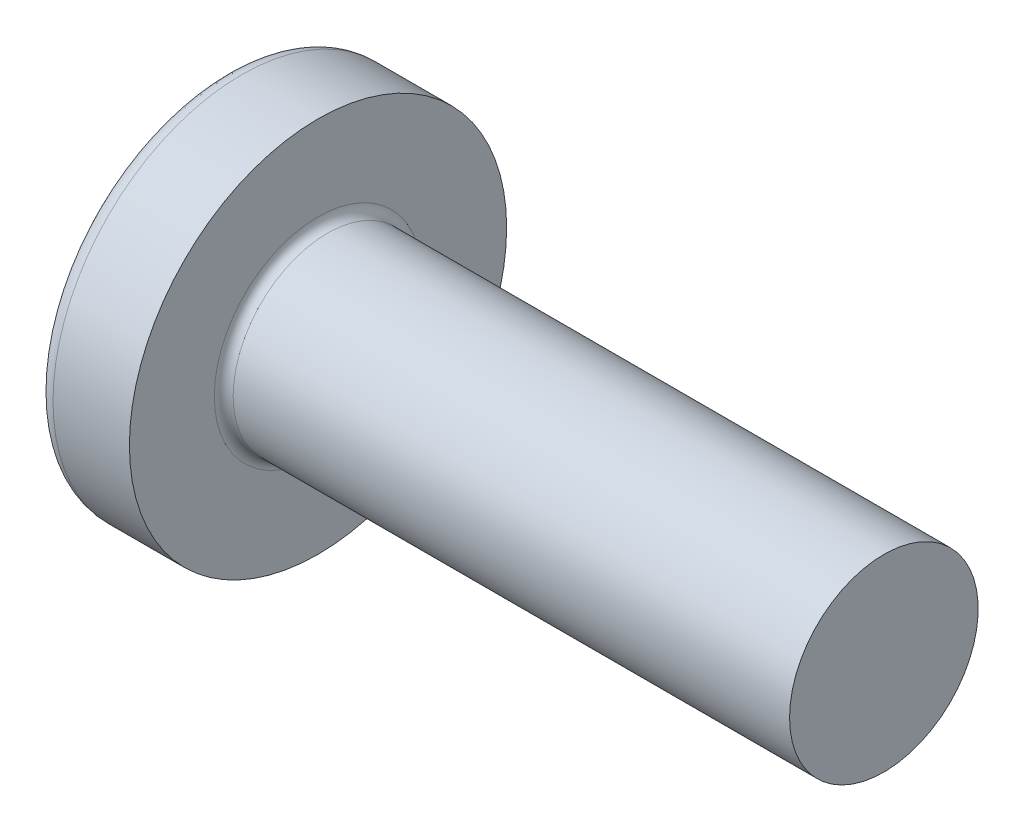
ISO-10303-21;
HEADER;
FILE_DESCRIPTION(('STEP AP214'),'2;1');
FILE_NAME('part.step','',(''),(''),'','','');
FILE_SCHEMA(('AUTOMOTIVE_DESIGN { 1 0 10303 214 1 1 1 1 }'));
ENDSEC;
DATA;
#1=APPLICATION_CONTEXT('core data for automotive mechanical design processes');
#2=APPLICATION_PROTOCOL_DEFINITION('international standard','automotive_design',2000,#1);
#3=PRODUCT_CONTEXT('',#1,'mechanical');
#4=PRODUCT('Part','Part','',(#3));
#5=PRODUCT_RELATED_PRODUCT_CATEGORY('part','',(#4));
#6=PRODUCT_DEFINITION_FORMATION('','',#4);
#7=PRODUCT_DEFINITION_CONTEXT('part definition',#1,'design');
#8=PRODUCT_DEFINITION('design','',#6,#7);
#9=PRODUCT_DEFINITION_SHAPE('','',#8);
#10=(LENGTH_UNIT() NAMED_UNIT(*) SI_UNIT(.MILLI.,.METRE.));
#11=(NAMED_UNIT(*) PLANE_ANGLE_UNIT() SI_UNIT($,.RADIAN.));
#12=(NAMED_UNIT(*) SI_UNIT($,.STERADIAN.) SOLID_ANGLE_UNIT());
#13=UNCERTAINTY_MEASURE_WITH_UNIT(LENGTH_MEASURE(1.E-05),#10,'distance_accuracy_value','');
#14=(GEOMETRIC_REPRESENTATION_CONTEXT(3) GLOBAL_UNCERTAINTY_ASSIGNED_CONTEXT((#13)) GLOBAL_UNIT_ASSIGNED_CONTEXT((#10,
#11,#12)) REPRESENTATION_CONTEXT('',''));
#15=CARTESIAN_POINT('',(0.,0.,0.));
#16=DIRECTION('',(0.,0.,1.));
#17=DIRECTION('',(1.,0.,0.));
#18=AXIS2_PLACEMENT_3D('',#15,#16,#17);
#19=CARTESIAN_POINT('',(3.2,0.,0.));
#20=DIRECTION('',(-1.,0.,0.));
#21=DIRECTION('',(0.,1.,0.));
#22=AXIS2_PLACEMENT_3D('',#19,#20,#21);
#23=SPHERICAL_SURFACE('',#22,3.2);
#24=CARTESIAN_POINT('',(0.646379599446113,0.,0.));
#25=DIRECTION('',(-1.,0.,0.));
#26=DIRECTION('',(0.,0.,1.));
#27=AXIS2_PLACEMENT_3D('',#24,#25,#26);
#28=CIRCLE('',#27,1.92847682119205);
#29=CARTESIAN_POINT('',(0.646379599446113,0.,1.92847682119205));
#30=VERTEX_POINT('',#29);
#31=EDGE_CURVE('E238',#30,#30,#28,.T.);
#32=ORIENTED_EDGE('',*,*,#31,.T.);
#33=EDGE_LOOP('',(#32));
#34=FACE_BOUND('',#33,.T.);
#35=CARTESIAN_POINT('',(0.0321614467928858,0.,0.));
#36=DIRECTION('',(1.,0.,0.));
#37=DIRECTION('',(0.,0.,-1.));
#38=AXIS2_PLACEMENT_3D('',#35,#36,#37);
#39=CIRCLE('',#38,0.452547125518057);
#40=CARTESIAN_POINT('',(0.0321614467928857,-0.239999999999998,-0.38366508938742));
#41=VERTEX_POINT('',#40);
#42=CARTESIAN_POINT('',(0.0321614467928858,-0.383665089387422,-0.24));
#43=VERTEX_POINT('',#42);
#44=EDGE_CURVE('E374',#41,#43,#39,.F.);
#45=ORIENTED_EDGE('',*,*,#44,.F.);
#46=CARTESIAN_POINT('',(3.2,-0.24,0.));
#47=DIRECTION('',(0.,1.,0.));
#48=DIRECTION('',(0.,0.,1.));
#49=AXIS2_PLACEMENT_3D('',#46,#47,#48);
#50=CIRCLE('',#49,3.19098730802866);
#51=CARTESIAN_POINT('',(0.160076673366103,-0.239999999999996,-0.970188728128244));
#52=VERTEX_POINT('',#51);
#53=EDGE_CURVE('E300',#52,#41,#50,.T.);
#54=ORIENTED_EDGE('',*,*,#53,.F.);
#55=CARTESIAN_POINT('',(2.98218780828175,0.,0.436863744320002));
#56=DIRECTION('',(0.446197753347436,0.,-0.894934391398443));
#57=DIRECTION('',(-0.894934391398442,0.,-0.446197753347436));
#58=AXIS2_PLACEMENT_3D('',#55,#56,#57);
#59=CIRCLE('',#58,3.16254769419176);
#60=CARTESIAN_POINT('',(0.160076673366103,0.240000000000003,-0.970188728128242));
#61=VERTEX_POINT('',#60);
#62=EDGE_CURVE('E272',#52,#61,#59,.T.);
#63=ORIENTED_EDGE('',*,*,#62,.T.);
#64=CARTESIAN_POINT('',(3.2,0.24,0.));
#65=DIRECTION('',(0.,-1.,0.));
#66=DIRECTION('',(0.,0.,-1.));
#67=AXIS2_PLACEMENT_3D('',#64,#65,#66);
#68=CIRCLE('',#67,3.19098730802866);
#69=CARTESIAN_POINT('',(0.0321614467928856,0.240000000000001,-0.383665089387418));
#70=VERTEX_POINT('',#69);
#71=EDGE_CURVE('E327',#70,#61,#68,.T.);
#72=ORIENTED_EDGE('',*,*,#71,.F.);
#73=CARTESIAN_POINT('',(0.0321614467928858,0.38366508938742,-0.24));
#74=VERTEX_POINT('',#73);
#75=EDGE_CURVE('E393',#74,#70,#39,.F.);
#76=ORIENTED_EDGE('',*,*,#75,.F.);
#77=CARTESIAN_POINT('',(3.2,0.,-0.24));
#78=DIRECTION('',(0.,0.,1.));
#79=DIRECTION('',(1.,0.,0.));
#80=AXIS2_PLACEMENT_3D('',#77,#78,#79);
#81=CIRCLE('',#80,3.19098730802866);
#82=CARTESIAN_POINT('',(0.160076673366103,0.970188728128243,-0.24));
#83=VERTEX_POINT('',#82);
#84=EDGE_CURVE('E266',#83,#74,#81,.T.);
#85=ORIENTED_EDGE('',*,*,#84,.F.);
#86=CARTESIAN_POINT('',(2.98218780828175,-0.436863744320003,0.));
#87=DIRECTION('',(0.446197753347436,0.894934391398443,0.));
#88=DIRECTION('',(-0.894934391398443,0.446197753347436,0.));
#89=AXIS2_PLACEMENT_3D('',#86,#87,#88);
#90=CIRCLE('',#89,3.16254769419176);
#91=CARTESIAN_POINT('',(0.160076673366103,0.970188728128243,0.24));
#92=VERTEX_POINT('',#91);
#93=EDGE_CURVE('E269',#83,#92,#90,.T.);
#94=ORIENTED_EDGE('',*,*,#93,.T.);
#95=CARTESIAN_POINT('',(3.2,0.,0.24));
#96=DIRECTION('',(0.,0.,-1.));
#97=DIRECTION('',(-1.,0.,0.));
#98=AXIS2_PLACEMENT_3D('',#95,#96,#97);
#99=CIRCLE('',#98,3.19098730802866);
#100=CARTESIAN_POINT('',(0.0321614467928861,0.383665089387419,0.239999999999999));
#101=VERTEX_POINT('',#100);
#102=EDGE_CURVE('E262',#101,#92,#99,.T.);
#103=ORIENTED_EDGE('',*,*,#102,.F.);
#104=CARTESIAN_POINT('',(0.0321614467928857,0.239999999999999,0.38366508938742));
#105=VERTEX_POINT('',#104);
#106=EDGE_CURVE('E431',#105,#101,#39,.F.);
#107=ORIENTED_EDGE('',*,*,#106,.F.);
#108=CARTESIAN_POINT('',(0.160076673366103,0.239999999999997,0.970188728128244));
#109=VERTEX_POINT('',#108);
#110=EDGE_CURVE('E282',#109,#105,#68,.T.);
#111=ORIENTED_EDGE('',*,*,#110,.F.);
#112=CARTESIAN_POINT('',(2.98218780828175,0.,-0.436863744320002));
#113=DIRECTION('',(0.446197753347436,0.,0.894934391398443));
#114=DIRECTION('',(0.894934391398443,0.,-0.446197753347436));
#115=AXIS2_PLACEMENT_3D('',#112,#113,#114);
#116=CIRCLE('',#115,3.16254769419176);
#117=CARTESIAN_POINT('',(0.160076673366103,-0.240000000000003,0.970188728128242));
#118=VERTEX_POINT('',#117);
#119=EDGE_CURVE('E49',#109,#118,#116,.T.);
#120=ORIENTED_EDGE('',*,*,#119,.T.);
#121=CARTESIAN_POINT('',(0.0321614467928856,-0.240000000000001,0.383665089387418));
#122=VERTEX_POINT('',#121);
#123=EDGE_CURVE('E279',#122,#118,#50,.T.);
#124=ORIENTED_EDGE('',*,*,#123,.F.);
#125=CARTESIAN_POINT('',(0.0321614467928861,-0.383665089387421,0.239999999999999));
#126=VERTEX_POINT('',#125);
#127=EDGE_CURVE('E392',#126,#122,#39,.F.);
#128=ORIENTED_EDGE('',*,*,#127,.F.);
#129=CARTESIAN_POINT('',(0.160076673366103,-0.970188728128243,0.24));
#130=VERTEX_POINT('',#129);
#131=EDGE_CURVE('E263',#130,#126,#99,.T.);
#132=ORIENTED_EDGE('',*,*,#131,.F.);
#133=CARTESIAN_POINT('',(2.98218780828175,0.436863744320002,0.));
#134=DIRECTION('',(0.446197753347436,-0.894934391398443,0.));
#135=DIRECTION('',(0.894934391398442,0.446197753347436,0.));
#136=AXIS2_PLACEMENT_3D('',#133,#134,#135);
#137=CIRCLE('',#136,3.16254769419176);
#138=CARTESIAN_POINT('',(0.160076673366102,-0.970188728128244,-0.24));
#139=VERTEX_POINT('',#138);
#140=EDGE_CURVE('E259',#130,#139,#137,.T.);
#141=ORIENTED_EDGE('',*,*,#140,.T.);
#142=EDGE_CURVE('E64',#43,#139,#81,.T.);
#143=ORIENTED_EDGE('',*,*,#142,.F.);
#144=EDGE_LOOP('',(#45,#54,#63,#72,#76,#85,#94,#103,#107,#111,#120,#124,#128,#132,#141,#143));
#145=FACE_BOUND('',#144,.T.);
#146=ADVANCED_FACE('F35',(#34,#145),#23,.T.);
#147=CARTESIAN_POINT('',(1.42,0.342014234961647,-0.24));
#148=DIRECTION('',(0.,0.,1.));
#149=DIRECTION('',(1.,0.,0.));
#150=AXIS2_PLACEMENT_3D('',#147,#148,#149);
#151=PLANE('',#150);
#152=ORIENTED_EDGE('',*,*,#84,.T.);
#153=CARTESIAN_POINT('',(-0.626811087646334,0.437068483432734,-0.24));
#154=CARTESIAN_POINT('',(-0.489788496188268,0.426133650699674,-0.24));
#155=CARTESIAN_POINT('',(-0.35277275089666,0.415111501640761,-0.24));
#156=CARTESIAN_POINT('',(-0.0787578829644782,0.392826208775377,-0.24));
#157=CARTESIAN_POINT('',(0.0582412392502157,0.381563059737591,-0.24));
#158=CARTESIAN_POINT('',(0.332213907654152,0.358729879929546,-0.24));
#159=CARTESIAN_POINT('',(0.469187453856034,0.347159849311357,-0.24));
#160=CARTESIAN_POINT('',(0.743097225439296,0.323608060039765,-0.24));
#161=CARTESIAN_POINT('',(0.880033451350376,0.311626307573655,-0.24));
#162=CARTESIAN_POINT('',(1.12503843743479,0.289667437089413,-0.24));
#163=CARTESIAN_POINT('',(1.23311691791999,0.279799173776849,-0.24));
#164=CARTESIAN_POINT('',(1.4492267018282,0.259570129968442,-0.24));
#165=CARTESIAN_POINT('',(1.55725800577256,0.249209355061897,-0.24));
#166=CARTESIAN_POINT('',(1.77325939831777,0.227783788850472,-0.24));
#167=CARTESIAN_POINT('',(1.88122948205844,0.216718947894399,-0.24));
#168=CARTESIAN_POINT('',(2.04309848476113,0.199296215271932,-0.24));
#169=CARTESIAN_POINT('',(2.09704158415864,0.193350927204474,-0.24));
#170=CARTESIAN_POINT('',(2.20488609252136,0.181086542764125,-0.24));
#171=CARTESIAN_POINT('',(2.25878750075649,0.174767439988846,-0.24));
#172=CARTESIAN_POINT('',(2.31266102213859,0.168212174791089,-0.24));
#173=B_SPLINE_CURVE_WITH_KNOTS('',3,(#153,#154,#155,#156,#157,#158,#159,#160,#161,#162,#163,
#164,#165,#166,#167,#168,#169,#170,#171,#172),.UNSPECIFIED.,.F.,.F.,(4,2,2,2,2,2,2,2,2,4),(0.,
0.412374804430943,0.824758569256476,1.23714212973639,1.64951949568622,1.97510284899868,
2.30068250829037,2.62628515317116,2.78909323564388,2.95190410736571),.UNSPECIFIED.);
#174=CARTESIAN_POINT('',(1.42,0.262259890185288,-0.240000000000001));
#175=VERTEX_POINT('',#174);
#176=EDGE_CURVE('E416',#74,#175,#173,.T.);
#177=ORIENTED_EDGE('',*,*,#176,.T.);
#178=DIRECTION('',(0.,1.,0.));
#179=VECTOR('',#178,1.);
#180=CARTESIAN_POINT('',(1.42,-0.342014234961647,-0.24));
#181=LINE('',#180,#179);
#182=CARTESIAN_POINT('',(1.42,0.342014234961647,-0.24));
#183=VERTEX_POINT('',#182);
#184=EDGE_CURVE('E356',#175,#183,#181,.T.);
#185=ORIENTED_EDGE('',*,*,#184,.T.);
#186=DIRECTION('',(0.894934391398442,-0.446197753347436,0.));
#187=VECTOR('',#186,1.);
#188=CARTESIAN_POINT('',(0.,1.05,-0.24));
#189=LINE('',#188,#187);
#190=EDGE_CURVE('E239',#83,#183,#189,.T.);
#191=ORIENTED_EDGE('',*,*,#190,.F.);
#192=EDGE_LOOP('',(#152,#177,#185,#191));
#193=FACE_BOUND('',#192,.T.);
#194=ADVANCED_FACE('F194',(#193),#151,.T.);
#195=CARTESIAN_POINT('',(1.42,-0.342014234961647,-0.24));
#196=VERTEX_POINT('',#195);
#197=CARTESIAN_POINT('',(1.42,-0.262259890185288,-0.240000000000001));
#198=VERTEX_POINT('',#197);
#199=EDGE_CURVE('E247',#196,#198,#181,.T.);
#200=ORIENTED_EDGE('',*,*,#199,.T.);
#201=CARTESIAN_POINT('',(-0.626811087646334,-0.437068483432733,-0.24));
#202=CARTESIAN_POINT('',(-0.489788496188268,-0.426133650699674,-0.24));
#203=CARTESIAN_POINT('',(-0.35277275089666,-0.415111501640761,-0.24));
#204=CARTESIAN_POINT('',(-0.0787578829644784,-0.392826208775377,-0.24));
#205=CARTESIAN_POINT('',(0.0582412392502156,-0.381563059737591,-0.24));
#206=CARTESIAN_POINT('',(0.332213907654152,-0.358729879929546,-0.24));
#207=CARTESIAN_POINT('',(0.469187453856034,-0.347159849311357,-0.24));
#208=CARTESIAN_POINT('',(0.743097225439296,-0.323608060039765,-0.24));
#209=CARTESIAN_POINT('',(0.880033451350376,-0.311626307573655,-0.24));
#210=CARTESIAN_POINT('',(1.12503843743479,-0.289667437089413,-0.24));
#211=CARTESIAN_POINT('',(1.23311691791999,-0.279799173776849,-0.24));
#212=CARTESIAN_POINT('',(1.4492267018282,-0.259570129968442,-0.24));
#213=CARTESIAN_POINT('',(1.55725800577256,-0.249209355061897,-0.24));
#214=CARTESIAN_POINT('',(1.77325939831777,-0.227783788850472,-0.24));
#215=CARTESIAN_POINT('',(1.88122948205844,-0.216718947894398,-0.24));
#216=CARTESIAN_POINT('',(2.04309848476113,-0.199296215271932,-0.24));
#217=CARTESIAN_POINT('',(2.09704158415864,-0.193350927204474,-0.24));
#218=CARTESIAN_POINT('',(2.20488609252136,-0.181086542764125,-0.24));
#219=CARTESIAN_POINT('',(2.25878750075649,-0.174767439988846,-0.24));
#220=CARTESIAN_POINT('',(2.31266102213859,-0.168212174791089,-0.24));
#221=B_SPLINE_CURVE_WITH_KNOTS('',3,(#201,#202,#203,#204,#205,#206,#207,#208,#209,#210,#211,
#212,#213,#214,#215,#216,#217,#218,#219,#220),.UNSPECIFIED.,.F.,.F.,(4,2,2,2,2,2,2,2,2,4),(0.,
0.412374804430943,0.824758569256476,1.23714212973639,1.64951949568622,1.97510284899868,
2.30068250829037,2.62628515317116,2.78909323564388,2.95190410736571),.UNSPECIFIED.);
#222=EDGE_CURVE('E391',#198,#43,#221,.F.);
#223=ORIENTED_EDGE('',*,*,#222,.T.);
#224=ORIENTED_EDGE('',*,*,#142,.T.);
#225=DIRECTION('',(0.894934391398442,0.446197753347436,0.));
#226=VECTOR('',#225,1.);
#227=CARTESIAN_POINT('',(0.,-1.05,-0.24));
#228=LINE('',#227,#226);
#229=EDGE_CURVE('E330',#139,#196,#228,.T.);
#230=ORIENTED_EDGE('',*,*,#229,.T.);
#231=EDGE_LOOP('',(#200,#223,#224,#230));
#232=FACE_BOUND('',#231,.T.);
#233=ADVANCED_FACE('F200',(#232),#151,.T.);
#234=CARTESIAN_POINT('',(1.42,-0.342014234961647,0.24));
#235=DIRECTION('',(0.,0.,-1.));
#236=DIRECTION('',(-1.,0.,0.));
#237=AXIS2_PLACEMENT_3D('',#234,#235,#236);
#238=PLANE('',#237);
#239=DIRECTION('',(0.,-1.,0.));
#240=VECTOR('',#239,1.);
#241=CARTESIAN_POINT('',(1.42,0.342014234961647,0.24));
#242=LINE('',#241,#240);
#243=CARTESIAN_POINT('',(1.42,0.342014234961647,0.24));
#244=VERTEX_POINT('',#243);
#245=CARTESIAN_POINT('',(1.42,0.262259890185289,0.240000000000001));
#246=VERTEX_POINT('',#245);
#247=EDGE_CURVE('E339',#244,#246,#242,.T.);
#248=ORIENTED_EDGE('',*,*,#247,.T.);
#249=CARTESIAN_POINT('',(-0.62681108769363,0.437068483436507,0.239999999999999));
#250=CARTESIAN_POINT('',(-0.489788496230297,0.426133650703048,0.239999999999999));
#251=CARTESIAN_POINT('',(-0.352772750933422,0.415111501643733,0.239999999999999));
#252=CARTESIAN_POINT('',(-0.078757882990706,0.392826208777529,0.239999999999999));
#253=CARTESIAN_POINT('',(0.0582412392292548,0.381563059739326,0.24));
#254=CARTESIAN_POINT('',(0.332213907649303,0.358729879929962,0.24));
#255=CARTESIAN_POINT('',(0.46918745386203,0.347159849310859,0.24));
#256=CARTESIAN_POINT('',(0.743097225466975,0.323608060037368,0.24));
#257=CARTESIAN_POINT('',(0.880033451388893,0.311626307570274,0.24));
#258=CARTESIAN_POINT('',(1.12503843748414,0.289667437084935,0.24));
#259=CARTESIAN_POINT('',(1.23311691796933,0.279799173772307,0.24));
#260=CARTESIAN_POINT('',(1.44922670187753,0.259570129963748,0.24));
#261=CARTESIAN_POINT('',(1.55725800582188,0.249209355057115,0.24));
#262=CARTESIAN_POINT('',(1.77325939836707,0.227783788845471,0.24));
#263=CARTESIAN_POINT('',(1.88122948210773,0.216718947889267,0.24));
#264=CARTESIAN_POINT('',(2.0430984848104,0.199296215266543,0.24));
#265=CARTESIAN_POINT('',(2.0970415842079,0.193350927198989,0.24));
#266=CARTESIAN_POINT('',(2.20488609257059,0.181086542758414,0.24));
#267=CARTESIAN_POINT('',(2.25878750080571,0.174767439983005,0.24));
#268=CARTESIAN_POINT('',(2.31266102218779,0.168212174785094,0.24));
#269=B_SPLINE_CURVE_WITH_KNOTS('',3,(#249,#250,#251,#252,#253,#254,#255,#256,#257,#258,#259,
#260,#261,#262,#263,#264,#265,#266,#267,#268),.UNSPECIFIED.,.F.,.F.,(4,2,2,2,2,2,2,2,2,4),(0.,
0.412374804446791,0.824758569288173,1.23714212980074,1.64951949578321,1.97510284909568,
2.30068250838736,2.62628515326816,2.78909323574088,2.95190410746272),.UNSPECIFIED.);
#270=EDGE_CURVE('E432',#246,#101,#269,.F.);
#271=ORIENTED_EDGE('',*,*,#270,.T.);
#272=ORIENTED_EDGE('',*,*,#102,.T.);
#273=DIRECTION('',(0.894934391398442,-0.446197753347436,0.));
#274=VECTOR('',#273,1.);
#275=CARTESIAN_POINT('',(0.,1.05,0.24));
#276=LINE('',#275,#274);
#277=EDGE_CURVE('E244',#92,#244,#276,.T.);
#278=ORIENTED_EDGE('',*,*,#277,.T.);
#279=EDGE_LOOP('',(#248,#271,#272,#278));
#280=FACE_BOUND('',#279,.T.);
#281=ADVANCED_FACE('F412',(#280),#238,.T.);
#282=ORIENTED_EDGE('',*,*,#131,.T.);
#283=CARTESIAN_POINT('',(-0.62681108769363,-0.437068483436507,0.239999999999999));
#284=CARTESIAN_POINT('',(-0.489788496230297,-0.426133650703048,0.239999999999999));
#285=CARTESIAN_POINT('',(-0.352772750933422,-0.415111501643733,0.239999999999999));
#286=CARTESIAN_POINT('',(-0.0787578829907056,-0.392826208777529,0.239999999999999));
#287=CARTESIAN_POINT('',(0.0582412392292551,-0.381563059739326,0.24));
#288=CARTESIAN_POINT('',(0.332213907649304,-0.358729879929962,0.24));
#289=CARTESIAN_POINT('',(0.46918745386203,-0.347159849310859,0.24));
#290=CARTESIAN_POINT('',(0.743097225466975,-0.323608060037368,0.24));
#291=CARTESIAN_POINT('',(0.880033451388893,-0.311626307570274,0.24));
#292=CARTESIAN_POINT('',(1.12503843748414,-0.289667437084935,0.24));
#293=CARTESIAN_POINT('',(1.23311691796933,-0.279799173772307,0.24));
#294=CARTESIAN_POINT('',(1.44922670187753,-0.259570129963748,0.24));
#295=CARTESIAN_POINT('',(1.55725800582188,-0.249209355057115,0.24));
#296=CARTESIAN_POINT('',(1.77325939836707,-0.227783788845471,0.24));
#297=CARTESIAN_POINT('',(1.88122948210773,-0.216718947889267,0.24));
#298=CARTESIAN_POINT('',(2.0430984848104,-0.199296215266543,0.24));
#299=CARTESIAN_POINT('',(2.0970415842079,-0.193350927198989,0.24));
#300=CARTESIAN_POINT('',(2.20488609257059,-0.181086542758414,0.24));
#301=CARTESIAN_POINT('',(2.25878750080571,-0.174767439983005,0.24));
#302=CARTESIAN_POINT('',(2.31266102218779,-0.168212174785094,0.24));
#303=B_SPLINE_CURVE_WITH_KNOTS('',3,(#283,#284,#285,#286,#287,#288,#289,#290,#291,#292,#293,
#294,#295,#296,#297,#298,#299,#300,#301,#302),.UNSPECIFIED.,.F.,.F.,(4,2,2,2,2,2,2,2,2,4),(0.,
0.412374804446791,0.824758569288173,1.23714212980074,1.64951949578321,1.97510284909568,
2.30068250838736,2.62628515326816,2.78909323574088,2.95190410746272),.UNSPECIFIED.);
#304=CARTESIAN_POINT('',(1.42,-0.262259890185289,0.240000000000001));
#305=VERTEX_POINT('',#304);
#306=EDGE_CURVE('E453',#126,#305,#303,.T.);
#307=ORIENTED_EDGE('',*,*,#306,.T.);
#308=CARTESIAN_POINT('',(1.42,-0.342014234961647,0.24));
#309=VERTEX_POINT('',#308);
#310=EDGE_CURVE('E341',#305,#309,#242,.T.);
#311=ORIENTED_EDGE('',*,*,#310,.T.);
#312=DIRECTION('',(0.894934391398442,0.446197753347436,0.));
#313=VECTOR('',#312,1.);
#314=CARTESIAN_POINT('',(0.,-1.05,0.239999999999999));
#315=LINE('',#314,#313);
#316=EDGE_CURVE('E332',#130,#309,#315,.T.);
#317=ORIENTED_EDGE('',*,*,#316,.F.);
#318=EDGE_LOOP('',(#282,#307,#311,#317));
#319=FACE_BOUND('',#318,.T.);
#320=ADVANCED_FACE('F515',(#319),#238,.T.);
#321=CARTESIAN_POINT('',(1.42,0.342014234961647,0.24));
#322=DIRECTION('',(0.446197753347436,0.894934391398443,0.));
#323=DIRECTION('',(-0.894934391398443,0.446197753347436,0.));
#324=AXIS2_PLACEMENT_3D('',#321,#322,#323);
#325=PLANE('',#324);
#326=CARTESIAN_POINT('',(2.01772965253961,0.0439972734550526,0.));
#327=DIRECTION('',(0.446197753347436,0.894934391398443,0.));
#328=DIRECTION('',(-0.894934391398443,0.446197753347436,0.));
#329=AXIS2_PLACEMENT_3D('',#326,#327,#328);
#330=ELLIPSE('',#329,0.703057486597294,0.310602005333466);
#331=CARTESIAN_POINT('',(1.42,0.342014234961648,0.0969871799961127));
#332=VERTEX_POINT('',#331);
#333=CARTESIAN_POINT('',(1.42,0.342014234961648,-0.0969871799961128));
#334=VERTEX_POINT('',#333);
#335=EDGE_CURVE('E305',#332,#334,#330,.F.);
#336=ORIENTED_EDGE('',*,*,#335,.F.);
#337=DIRECTION('',(0.,0.,-1.));
#338=VECTOR('',#337,1.);
#339=CARTESIAN_POINT('',(1.42,0.342014234961647,0.24));
#340=LINE('',#339,#338);
#341=EDGE_CURVE('E342',#244,#332,#340,.T.);
#342=ORIENTED_EDGE('',*,*,#341,.F.);
#343=ORIENTED_EDGE('',*,*,#277,.F.);
#344=ORIENTED_EDGE('',*,*,#93,.F.);
#345=ORIENTED_EDGE('',*,*,#190,.T.);
#346=EDGE_CURVE('E344',#334,#183,#340,.T.);
#347=ORIENTED_EDGE('',*,*,#346,.F.);
#348=EDGE_LOOP('',(#336,#342,#343,#344,#345,#347));
#349=FACE_BOUND('',#348,.T.);
#350=ADVANCED_FACE('F410',(#349),#325,.F.);
#351=CARTESIAN_POINT('',(1.42,-0.342014234961647,-0.24));
#352=DIRECTION('',(0.446197753347436,-0.894934391398443,0.));
#353=DIRECTION('',(0.894934391398442,0.446197753347436,0.));
#354=AXIS2_PLACEMENT_3D('',#351,#352,#353);
#355=PLANE('',#354);
#356=CARTESIAN_POINT('',(2.01772965253961,-0.0439972734550524,0.));
#357=DIRECTION('',(0.446197753347436,-0.894934391398443,0.));
#358=DIRECTION('',(-0.894934391398443,-0.446197753347436,0.));
#359=AXIS2_PLACEMENT_3D('',#356,#357,#358);
#360=ELLIPSE('',#359,0.703057486597294,0.310602005333466);
#361=CARTESIAN_POINT('',(1.42,-0.342014234961649,-0.0969871799961114));
#362=VERTEX_POINT('',#361);
#363=CARTESIAN_POINT('',(1.42,-0.342014234961649,0.0969871799961114));
#364=VERTEX_POINT('',#363);
#365=EDGE_CURVE('E459',#362,#364,#360,.F.);
#366=ORIENTED_EDGE('',*,*,#365,.F.);
#367=DIRECTION('',(0.,0.,1.));
#368=VECTOR('',#367,1.);
#369=CARTESIAN_POINT('',(1.42,-0.342014234961647,-0.24));
#370=LINE('',#369,#368);
#371=EDGE_CURVE('E335',#196,#362,#370,.T.);
#372=ORIENTED_EDGE('',*,*,#371,.F.);
#373=ORIENTED_EDGE('',*,*,#229,.F.);
#374=ORIENTED_EDGE('',*,*,#140,.F.);
#375=ORIENTED_EDGE('',*,*,#316,.T.);
#376=EDGE_CURVE('E338',#364,#309,#370,.T.);
#377=ORIENTED_EDGE('',*,*,#376,.F.);
#378=EDGE_LOOP('',(#366,#372,#373,#374,#375,#377));
#379=FACE_BOUND('',#378,.T.);
#380=ADVANCED_FACE('F507',(#379),#355,.F.);
#381=CARTESIAN_POINT('',(1.42,-0.342014234961647,-0.24));
#382=DIRECTION('',(1.,0.,0.));
#383=DIRECTION('',(0.,0.,-1.));
#384=AXIS2_PLACEMENT_3D('',#381,#382,#383);
#385=PLANE('',#384);
#386=CARTESIAN_POINT('',(1.42,0.,0.));
#387=DIRECTION('',(-1.,0.,0.));
#388=DIRECTION('',(0.,0.,1.));
#389=AXIS2_PLACEMENT_3D('',#386,#387,#388);
#390=CIRCLE('',#389,0.3555);
#391=CARTESIAN_POINT('',(1.42,-0.0969871799961137,-0.342014234961648));
#392=VERTEX_POINT('',#391);
#393=CARTESIAN_POINT('',(1.42,-0.239999999999999,-0.262259890185288));
#394=VERTEX_POINT('',#393);
#395=EDGE_CURVE('E56',#392,#394,#390,.T.);
#396=ORIENTED_EDGE('',*,*,#395,.F.);
#397=DIRECTION('',(0.,-1.,0.));
#398=VECTOR('',#397,1.);
#399=CARTESIAN_POINT('',(1.42,0.240000000000001,-0.342014234961647));
#400=LINE('',#399,#398);
#401=CARTESIAN_POINT('',(1.42,-0.239999999999999,-0.342014234961648));
#402=VERTEX_POINT('',#401);
#403=EDGE_CURVE('E315',#392,#402,#400,.T.);
#404=ORIENTED_EDGE('',*,*,#403,.T.);
#405=DIRECTION('',(0.,0.,-1.));
#406=VECTOR('',#405,1.);
#407=CARTESIAN_POINT('',(1.42,-0.240000000000001,0.342014234961646));
#408=LINE('',#407,#406);
#409=EDGE_CURVE('E319',#394,#402,#408,.T.);
#410=ORIENTED_EDGE('',*,*,#409,.F.);
#411=EDGE_LOOP('',(#396,#404,#410));
#412=FACE_BOUND('',#411,.T.);
#413=ADVANCED_FACE('F380',(#412),#385,.F.);
#414=EDGE_CURVE('E385',#198,#362,#390,.T.);
#415=ORIENTED_EDGE('',*,*,#414,.F.);
#416=ORIENTED_EDGE('',*,*,#199,.F.);
#417=ORIENTED_EDGE('',*,*,#371,.T.);
#418=EDGE_LOOP('',(#415,#416,#417));
#419=FACE_BOUND('',#418,.T.);
#420=ADVANCED_FACE('F514',(#419),#385,.F.);
#421=EDGE_CURVE('E522',#364,#305,#390,.T.);
#422=ORIENTED_EDGE('',*,*,#421,.F.);
#423=ORIENTED_EDGE('',*,*,#376,.T.);
#424=ORIENTED_EDGE('',*,*,#310,.F.);
#425=EDGE_LOOP('',(#422,#423,#424));
#426=FACE_BOUND('',#425,.T.);
#427=ADVANCED_FACE('F503',(#426),#385,.F.);
#428=CARTESIAN_POINT('',(1.42,-0.240000000000001,0.262259890185289));
#429=VERTEX_POINT('',#428);
#430=CARTESIAN_POINT('',(1.42,-0.0969871799961173,0.342014234961647));
#431=VERTEX_POINT('',#430);
#432=EDGE_CURVE('E490',#429,#431,#390,.T.);
#433=ORIENTED_EDGE('',*,*,#432,.F.);
#434=CARTESIAN_POINT('',(1.42,-0.240000000000001,0.342014234961646));
#435=VERTEX_POINT('',#434);
#436=EDGE_CURVE('E316',#435,#429,#408,.T.);
#437=ORIENTED_EDGE('',*,*,#436,.F.);
#438=DIRECTION('',(0.,1.,0.));
#439=VECTOR('',#438,1.);
#440=CARTESIAN_POINT('',(1.42,-0.240000000000001,0.342014234961646));
#441=LINE('',#440,#439);
#442=EDGE_CURVE('E320',#435,#431,#441,.T.);
#443=ORIENTED_EDGE('',*,*,#442,.T.);
#444=EDGE_LOOP('',(#433,#437,#443));
#445=FACE_BOUND('',#444,.T.);
#446=ADVANCED_FACE('F488',(#445),#385,.F.);
#447=CARTESIAN_POINT('',(1.42,0.0969871799961151,0.342014234961648));
#448=VERTEX_POINT('',#447);
#449=CARTESIAN_POINT('',(1.42,0.239999999999999,0.26225989018529));
#450=VERTEX_POINT('',#449);
#451=EDGE_CURVE('E386',#448,#450,#390,.T.);
#452=ORIENTED_EDGE('',*,*,#451,.F.);
#453=CARTESIAN_POINT('',(1.42,0.239999999999999,0.342014234961648));
#454=VERTEX_POINT('',#453);
#455=EDGE_CURVE('E323',#448,#454,#441,.T.);
#456=ORIENTED_EDGE('',*,*,#455,.T.);
#457=DIRECTION('',(0.,0.,1.));
#458=VECTOR('',#457,1.);
#459=CARTESIAN_POINT('',(1.42,0.240000000000001,-0.342014234961647));
#460=LINE('',#459,#458);
#461=EDGE_CURVE('E297',#450,#454,#460,.T.);
#462=ORIENTED_EDGE('',*,*,#461,.F.);
#463=EDGE_LOOP('',(#452,#456,#462));
#464=FACE_BOUND('',#463,.T.);
#465=ADVANCED_FACE('F496',(#464),#385,.F.);
#466=EDGE_CURVE('E473',#246,#332,#390,.T.);
#467=ORIENTED_EDGE('',*,*,#466,.F.);
#468=ORIENTED_EDGE('',*,*,#247,.F.);
#469=ORIENTED_EDGE('',*,*,#341,.T.);
#470=EDGE_LOOP('',(#467,#468,#469));
#471=FACE_BOUND('',#470,.T.);
#472=ADVANCED_FACE('F498',(#471),#385,.F.);
#473=EDGE_CURVE('E471',#334,#175,#390,.T.);
#474=ORIENTED_EDGE('',*,*,#473,.F.);
#475=ORIENTED_EDGE('',*,*,#346,.T.);
#476=ORIENTED_EDGE('',*,*,#184,.F.);
#477=EDGE_LOOP('',(#474,#475,#476));
#478=FACE_BOUND('',#477,.T.);
#479=ADVANCED_FACE('F443',(#478),#385,.F.);
#480=CARTESIAN_POINT('',(1.42,-0.239999999999999,-0.342014234961648));
#481=DIRECTION('',(0.,1.,0.));
#482=DIRECTION('',(-1.,0.,0.));
#483=AXIS2_PLACEMENT_3D('',#480,#481,#482);
#484=PLANE('',#483);
#485=ORIENTED_EDGE('',*,*,#436,.T.);
#486=CARTESIAN_POINT('',(-0.62681108769363,-0.240000000000001,0.437068483436506));
#487=CARTESIAN_POINT('',(-0.489788496230297,-0.240000000000001,0.426133650703047));
#488=CARTESIAN_POINT('',(-0.352772750933422,-0.240000000000001,0.415111501643732));
#489=CARTESIAN_POINT('',(-0.0787578829907056,-0.240000000000001,0.392826208777528));
#490=CARTESIAN_POINT('',(0.0582412392292551,-0.240000000000001,0.381563059739325));
#491=CARTESIAN_POINT('',(0.332213907649304,-0.240000000000001,0.358729879929961));
#492=CARTESIAN_POINT('',(0.46918745386203,-0.240000000000001,0.347159849310858));
#493=CARTESIAN_POINT('',(0.743097225466975,-0.240000000000001,0.323608060037367));
#494=CARTESIAN_POINT('',(0.880033451388893,-0.240000000000001,0.311626307570273));
#495=CARTESIAN_POINT('',(1.12503843748414,-0.240000000000001,0.289667437084934));
#496=CARTESIAN_POINT('',(1.23311691796933,-0.240000000000001,0.279799173772306));
#497=CARTESIAN_POINT('',(1.44922670187753,-0.240000000000001,0.259570129963747));
#498=CARTESIAN_POINT('',(1.55725800582188,-0.240000000000001,0.249209355057114));
#499=CARTESIAN_POINT('',(1.77325939836707,-0.240000000000001,0.22778378884547));
#500=CARTESIAN_POINT('',(1.88122948210773,-0.240000000000001,0.216718947889266));
#501=CARTESIAN_POINT('',(2.0430984848104,-0.240000000000001,0.199296215266542));
#502=CARTESIAN_POINT('',(2.0970415842079,-0.240000000000001,0.193350927198988));
#503=CARTESIAN_POINT('',(2.20488609257059,-0.240000000000001,0.181086542758413));
#504=CARTESIAN_POINT('',(2.25878750080571,-0.240000000000001,0.174767439983004));
#505=CARTESIAN_POINT('',(2.31266102218779,-0.240000000000001,0.168212174785094));
#506=B_SPLINE_CURVE_WITH_KNOTS('',3,(#486,#487,#488,#489,#490,#491,#492,#493,#494,#495,#496,
#497,#498,#499,#500,#501,#502,#503,#504,#505),.UNSPECIFIED.,.F.,.F.,(4,2,2,2,2,2,2,2,2,4),(0.,
0.412374804446791,0.824758569288173,1.23714212980074,1.64951949578321,1.97510284909568,
2.30068250838736,2.62628515326816,2.78909323574088,2.95190410746272),.UNSPECIFIED.);
#507=EDGE_CURVE('E446',#429,#122,#506,.F.);
#508=ORIENTED_EDGE('',*,*,#507,.T.);
#509=ORIENTED_EDGE('',*,*,#123,.T.);
#510=DIRECTION('',(0.894934391398442,0.,-0.446197753347436));
#511=VECTOR('',#510,1.);
#512=CARTESIAN_POINT('',(0.,-0.240000000000003,1.05));
#513=LINE('',#512,#511);
#514=EDGE_CURVE('E292',#118,#435,#513,.T.);
#515=ORIENTED_EDGE('',*,*,#514,.T.);
#516=EDGE_LOOP('',(#485,#508,#509,#515));
#517=FACE_BOUND('',#516,.T.);
#518=ADVANCED_FACE('F229',(#517),#484,.T.);
#519=CARTESIAN_POINT('',(1.42,0.239999999999999,0.342014234961648));
#520=DIRECTION('',(0.,-1.,0.));
#521=DIRECTION('',(1.,0.,0.));
#522=AXIS2_PLACEMENT_3D('',#519,#520,#521);
#523=PLANE('',#522);
#524=ORIENTED_EDGE('',*,*,#110,.T.);
#525=CARTESIAN_POINT('',(-0.626811087646333,0.239999999999998,0.437068483432734));
#526=CARTESIAN_POINT('',(-0.489788496188268,0.239999999999999,0.426133650699674));
#527=CARTESIAN_POINT('',(-0.35277275089666,0.239999999999999,0.415111501640762));
#528=CARTESIAN_POINT('',(-0.078757882964478,0.239999999999999,0.392826208775377));
#529=CARTESIAN_POINT('',(0.0582412392502159,0.239999999999999,0.381563059737591));
#530=CARTESIAN_POINT('',(0.332213907654152,0.239999999999999,0.358729879929547));
#531=CARTESIAN_POINT('',(0.469187453856034,0.239999999999999,0.347159849311358));
#532=CARTESIAN_POINT('',(0.743097225439296,0.239999999999999,0.323608060039766));
#533=CARTESIAN_POINT('',(0.880033451350376,0.239999999999999,0.311626307573656));
#534=CARTESIAN_POINT('',(1.12503843743479,0.239999999999999,0.289667437089414));
#535=CARTESIAN_POINT('',(1.23311691791999,0.239999999999999,0.279799173776849));
#536=CARTESIAN_POINT('',(1.4492267018282,0.239999999999999,0.259570129968442));
#537=CARTESIAN_POINT('',(1.55725800577256,0.239999999999999,0.249209355061898));
#538=CARTESIAN_POINT('',(1.77325939831777,0.239999999999999,0.227783788850473));
#539=CARTESIAN_POINT('',(1.88122948205844,0.239999999999999,0.216718947894399));
#540=CARTESIAN_POINT('',(2.04309848476113,0.239999999999999,0.199296215271933));
#541=CARTESIAN_POINT('',(2.09704158415864,0.239999999999999,0.193350927204475));
#542=CARTESIAN_POINT('',(2.20488609252136,0.239999999999999,0.181086542764126));
#543=CARTESIAN_POINT('',(2.25878750075649,0.239999999999999,0.174767439988847));
#544=CARTESIAN_POINT('',(2.31266102213859,0.239999999999999,0.16821217479109));
#545=B_SPLINE_CURVE_WITH_KNOTS('',3,(#525,#526,#527,#528,#529,#530,#531,#532,#533,#534,#535,
#536,#537,#538,#539,#540,#541,#542,#543,#544),.UNSPECIFIED.,.F.,.F.,(4,2,2,2,2,2,2,2,2,4),(0.,
0.412374804430943,0.824758569256476,1.23714212973639,1.64951949568622,1.97510284899868,
2.30068250829037,2.62628515317116,2.78909323564388,2.95190410736571),.UNSPECIFIED.);
#546=EDGE_CURVE('E425',#105,#450,#545,.T.);
#547=ORIENTED_EDGE('',*,*,#546,.T.);
#548=ORIENTED_EDGE('',*,*,#461,.T.);
#549=DIRECTION('',(0.894934391398442,0.,-0.446197753347436));
#550=VECTOR('',#549,1.);
#551=CARTESIAN_POINT('',(0.,0.239999999999996,1.05));
#552=LINE('',#551,#550);
#553=EDGE_CURVE('E290',#109,#454,#552,.T.);
#554=ORIENTED_EDGE('',*,*,#553,.F.);
#555=EDGE_LOOP('',(#524,#547,#548,#554));
#556=FACE_BOUND('',#555,.T.);
#557=ADVANCED_FACE('F294',(#556),#523,.T.);
#558=CARTESIAN_POINT('',(1.42,-0.240000000000001,0.342014234961646));
#559=DIRECTION('',(0.446197753347436,0.,0.894934391398443));
#560=DIRECTION('',(-0.894934391398443,0.,0.446197753347436));
#561=AXIS2_PLACEMENT_3D('',#558,#559,#560);
#562=PLANE('',#561);
#563=CARTESIAN_POINT('',(2.01772965253961,0.,0.0439972734550526));
#564=DIRECTION('',(0.446197753347436,0.,0.894934391398443));
#565=DIRECTION('',(-0.894934391398443,0.,0.446197753347436));
#566=AXIS2_PLACEMENT_3D('',#563,#564,#565);
#567=ELLIPSE('',#566,0.703057486597294,0.310602005333466);
#568=EDGE_CURVE('E423',#431,#448,#567,.F.);
#569=ORIENTED_EDGE('',*,*,#568,.F.);
#570=ORIENTED_EDGE('',*,*,#442,.F.);
#571=ORIENTED_EDGE('',*,*,#514,.F.);
#572=ORIENTED_EDGE('',*,*,#119,.F.);
#573=ORIENTED_EDGE('',*,*,#553,.T.);
#574=ORIENTED_EDGE('',*,*,#455,.F.);
#575=EDGE_LOOP('',(#569,#570,#571,#572,#573,#574));
#576=FACE_BOUND('',#575,.T.);
#577=ADVANCED_FACE('F288',(#576),#562,.F.);
#578=CARTESIAN_POINT('',(1.42,0.240000000000001,-0.342014234961647));
#579=DIRECTION('',(0.446197753347436,0.,-0.894934391398443));
#580=DIRECTION('',(0.894934391398442,0.,0.446197753347436));
#581=AXIS2_PLACEMENT_3D('',#578,#579,#580);
#582=PLANE('',#581);
#583=CARTESIAN_POINT('',(2.01772965253961,0.,-0.0439972734550524));
#584=DIRECTION('',(0.446197753347436,0.,-0.894934391398443));
#585=DIRECTION('',(-0.894934391398443,0.,-0.446197753347436));
#586=AXIS2_PLACEMENT_3D('',#583,#584,#585);
#587=ELLIPSE('',#586,0.703057486597294,0.310602005333466);
#588=CARTESIAN_POINT('',(1.42,0.0969871799961161,-0.342014234961647));
#589=VERTEX_POINT('',#588);
#590=EDGE_CURVE('E378',#589,#392,#587,.F.);
#591=ORIENTED_EDGE('',*,*,#590,.F.);
#592=CARTESIAN_POINT('',(1.42,0.240000000000001,-0.342014234961647));
#593=VERTEX_POINT('',#592);
#594=EDGE_CURVE('E312',#593,#589,#400,.T.);
#595=ORIENTED_EDGE('',*,*,#594,.F.);
#596=DIRECTION('',(0.894934391398442,0.,0.446197753347436));
#597=VECTOR('',#596,1.);
#598=CARTESIAN_POINT('',(0.,0.240000000000004,-1.05));
#599=LINE('',#598,#597);
#600=EDGE_CURVE('E302',#61,#593,#599,.T.);
#601=ORIENTED_EDGE('',*,*,#600,.F.);
#602=ORIENTED_EDGE('',*,*,#62,.F.);
#603=DIRECTION('',(0.894934391398442,0.,0.446197753347436));
#604=VECTOR('',#603,1.);
#605=CARTESIAN_POINT('',(0.,-0.239999999999996,-1.05));
#606=LINE('',#605,#604);
#607=EDGE_CURVE('E309',#52,#402,#606,.T.);
#608=ORIENTED_EDGE('',*,*,#607,.T.);
#609=ORIENTED_EDGE('',*,*,#403,.F.);
#610=EDGE_LOOP('',(#591,#595,#601,#602,#608,#609));
#611=FACE_BOUND('',#610,.T.);
#612=ADVANCED_FACE('F369',(#611),#582,.F.);
#613=CARTESIAN_POINT('',(1.42,0.240000000000001,-0.262259890185288));
#614=VERTEX_POINT('',#613);
#615=EDGE_CURVE('E324',#593,#614,#460,.T.);
#616=ORIENTED_EDGE('',*,*,#615,.T.);
#617=CARTESIAN_POINT('',(-0.62681108769363,0.240000000000001,-0.437068483436506));
#618=CARTESIAN_POINT('',(-0.489788496230297,0.240000000000001,-0.426133650703047));
#619=CARTESIAN_POINT('',(-0.352772750933422,0.240000000000001,-0.415111501643732));
#620=CARTESIAN_POINT('',(-0.078757882990706,0.240000000000001,-0.392826208777528));
#621=CARTESIAN_POINT('',(0.0582412392292547,0.240000000000001,-0.381563059739325));
#622=CARTESIAN_POINT('',(0.332213907649303,0.240000000000001,-0.358729879929961));
#623=CARTESIAN_POINT('',(0.46918745386203,0.240000000000001,-0.347159849310858));
#624=CARTESIAN_POINT('',(0.743097225466974,0.240000000000001,-0.323608060037367));
#625=CARTESIAN_POINT('',(0.880033451388892,0.240000000000001,-0.311626307570273));
#626=CARTESIAN_POINT('',(1.12503843748414,0.240000000000001,-0.289667437084934));
#627=CARTESIAN_POINT('',(1.23311691796933,0.240000000000001,-0.279799173772306));
#628=CARTESIAN_POINT('',(1.44922670187753,0.240000000000001,-0.259570129963747));
#629=CARTESIAN_POINT('',(1.55725800582188,0.240000000000001,-0.249209355057114));
#630=CARTESIAN_POINT('',(1.77325939836707,0.240000000000001,-0.22778378884547));
#631=CARTESIAN_POINT('',(1.88122948210773,0.240000000000001,-0.216718947889266));
#632=CARTESIAN_POINT('',(2.0430984848104,0.240000000000001,-0.199296215266542));
#633=CARTESIAN_POINT('',(2.0970415842079,0.240000000000001,-0.193350927198988));
#634=CARTESIAN_POINT('',(2.20488609257059,0.240000000000001,-0.181086542758413));
#635=CARTESIAN_POINT('',(2.25878750080571,0.240000000000001,-0.174767439983004));
#636=CARTESIAN_POINT('',(2.31266102218779,0.240000000000001,-0.168212174785094));
#637=B_SPLINE_CURVE_WITH_KNOTS('',3,(#617,#618,#619,#620,#621,#622,#623,#624,#625,#626,#627,
#628,#629,#630,#631,#632,#633,#634,#635,#636),.UNSPECIFIED.,.F.,.F.,(4,2,2,2,2,2,2,2,2,4),(0.,
0.412374804446791,0.824758569288173,1.23714212980074,1.64951949578321,1.97510284909568,
2.30068250838736,2.62628515326816,2.78909323574088,2.95190410746272),.UNSPECIFIED.);
#638=EDGE_CURVE('E365',#614,#70,#637,.F.);
#639=ORIENTED_EDGE('',*,*,#638,.T.);
#640=ORIENTED_EDGE('',*,*,#71,.T.);
#641=ORIENTED_EDGE('',*,*,#600,.T.);
#642=EDGE_LOOP('',(#616,#639,#640,#641));
#643=FACE_BOUND('',#642,.T.);
#644=ADVANCED_FACE('F227',(#643),#523,.T.);
#645=ORIENTED_EDGE('',*,*,#53,.T.);
#646=CARTESIAN_POINT('',(-0.626811087646333,-0.239999999999998,-0.437068483432735));
#647=CARTESIAN_POINT('',(-0.489788496188268,-0.239999999999998,-0.426133650699675));
#648=CARTESIAN_POINT('',(-0.35277275089666,-0.239999999999998,-0.415111501640762));
#649=CARTESIAN_POINT('',(-0.078757882964478,-0.239999999999998,-0.392826208775378));
#650=CARTESIAN_POINT('',(0.0582412392502159,-0.239999999999998,-0.381563059737592));
#651=CARTESIAN_POINT('',(0.332213907654152,-0.239999999999998,-0.358729879929547));
#652=CARTESIAN_POINT('',(0.469187453856034,-0.239999999999998,-0.347159849311358));
#653=CARTESIAN_POINT('',(0.743097225439296,-0.239999999999999,-0.323608060039766));
#654=CARTESIAN_POINT('',(0.880033451350376,-0.239999999999999,-0.311626307573656));
#655=CARTESIAN_POINT('',(1.12503843743479,-0.239999999999999,-0.289667437089414));
#656=CARTESIAN_POINT('',(1.23311691792,-0.239999999999999,-0.27979917377685));
#657=CARTESIAN_POINT('',(1.4492267018282,-0.239999999999999,-0.259570129968443));
#658=CARTESIAN_POINT('',(1.55725800577256,-0.239999999999999,-0.249209355061898));
#659=CARTESIAN_POINT('',(1.77325939831777,-0.239999999999999,-0.227783788850473));
#660=CARTESIAN_POINT('',(1.88122948205844,-0.239999999999999,-0.216718947894399));
#661=CARTESIAN_POINT('',(2.04309848476113,-0.239999999999999,-0.199296215271933));
#662=CARTESIAN_POINT('',(2.09704158415864,-0.239999999999999,-0.193350927204475));
#663=CARTESIAN_POINT('',(2.20488609252136,-0.239999999999999,-0.181086542764126));
#664=CARTESIAN_POINT('',(2.25878750075649,-0.239999999999999,-0.174767439988847));
#665=CARTESIAN_POINT('',(2.31266102213859,-0.24,-0.16821217479109));
#666=B_SPLINE_CURVE_WITH_KNOTS('',3,(#646,#647,#648,#649,#650,#651,#652,#653,#654,#655,#656,
#657,#658,#659,#660,#661,#662,#663,#664,#665),.UNSPECIFIED.,.F.,.F.,(4,2,2,2,2,2,2,2,2,4),(0.,
0.412374804430943,0.824758569256476,1.23714212973639,1.64951949568622,1.97510284899868,
2.30068250829037,2.62628515317116,2.78909323564388,2.95190410736571),.UNSPECIFIED.);
#667=EDGE_CURVE('E11',#41,#394,#666,.T.);
#668=ORIENTED_EDGE('',*,*,#667,.T.);
#669=ORIENTED_EDGE('',*,*,#409,.T.);
#670=ORIENTED_EDGE('',*,*,#607,.F.);
#671=EDGE_LOOP('',(#645,#668,#669,#670));
#672=FACE_BOUND('',#671,.T.);
#673=ADVANCED_FACE('F222',(#672),#484,.T.);
#674=CARTESIAN_POINT('',(-25.4,0.,0.));
#675=DIRECTION('',(-1.,0.,0.));
#676=DIRECTION('',(0.,0.,1.));
#677=AXIS2_PLACEMENT_3D('',#674,#675,#676);
#678=CYLINDRICAL_SURFACE('',#677,1.);
#679=CARTESIAN_POINT('',(1.7,0.,0.));
#680=DIRECTION('',(-1.,0.,0.));
#681=DIRECTION('',(0.,0.,1.));
#682=AXIS2_PLACEMENT_3D('',#679,#680,#681);
#683=CIRCLE('',#682,1.);
#684=CARTESIAN_POINT('',(1.7,0.,1.));
#685=VERTEX_POINT('',#684);
#686=EDGE_CURVE('E233',#685,#685,#683,.F.);
#687=ORIENTED_EDGE('',*,*,#686,.T.);
#688=EDGE_LOOP('',(#687));
#689=FACE_BOUND('',#688,.T.);
#690=CARTESIAN_POINT('',(7.6,0.,0.));
#691=DIRECTION('',(-1.,0.,0.));
#692=DIRECTION('',(0.,0.,1.));
#693=AXIS2_PLACEMENT_3D('',#690,#691,#692);
#694=CIRCLE('',#693,1.);
#695=CARTESIAN_POINT('',(7.6,0.,1.));
#696=VERTEX_POINT('',#695);
#697=EDGE_CURVE('E236',#696,#696,#694,.T.);
#698=ORIENTED_EDGE('',*,*,#697,.T.);
#699=EDGE_LOOP('',(#698));
#700=FACE_BOUND('',#699,.T.);
#701=ADVANCED_FACE('F219',(#689,#700),#678,.T.);
#702=CARTESIAN_POINT('',(1.6,1.,0.));
#703=DIRECTION('',(-1.,0.,0.));
#704=DIRECTION('',(0.,0.,1.));
#705=AXIS2_PLACEMENT_3D('',#702,#703,#704);
#706=PLANE('',#705);
#707=CARTESIAN_POINT('',(1.6,0.,0.));
#708=DIRECTION('',(-1.,0.,0.));
#709=DIRECTION('',(0.,0.,1.));
#710=AXIS2_PLACEMENT_3D('',#707,#708,#709);
#711=CIRCLE('',#710,1.1);
#712=CARTESIAN_POINT('',(1.6,0.,1.1));
#713=VERTEX_POINT('',#712);
#714=EDGE_CURVE('E255',#713,#713,#711,.T.);
#715=ORIENTED_EDGE('',*,*,#714,.T.);
#716=EDGE_LOOP('',(#715));
#717=FACE_BOUND('',#716,.T.);
#718=CARTESIAN_POINT('',(1.6,0.,0.));
#719=DIRECTION('',(-1.,0.,0.));
#720=DIRECTION('',(0.,0.,1.));
#721=AXIS2_PLACEMENT_3D('',#718,#719,#720);
#722=CIRCLE('',#721,2.);
#723=CARTESIAN_POINT('',(1.6,0.,2.));
#724=VERTEX_POINT('',#723);
#725=EDGE_CURVE('E252',#724,#724,#722,.T.);
#726=ORIENTED_EDGE('',*,*,#725,.F.);
#727=EDGE_LOOP('',(#726));
#728=FACE_BOUND('',#727,.T.);
#729=ADVANCED_FACE('F216',(#717,#728),#706,.F.);
#730=CARTESIAN_POINT('',(-25.4,0.,0.));
#731=DIRECTION('',(-1.,0.,0.));
#732=DIRECTION('',(0.,0.,1.));
#733=AXIS2_PLACEMENT_3D('',#730,#731,#732);
#734=CYLINDRICAL_SURFACE('',#733,2.);
#735=ORIENTED_EDGE('',*,*,#725,.T.);
#736=EDGE_LOOP('',(#735));
#737=FACE_BOUND('',#736,.T.);
#738=CARTESIAN_POINT('',(0.790020746977271,0.,0.));
#739=DIRECTION('',(-1.,0.,0.));
#740=DIRECTION('',(0.,0.,1.));
#741=AXIS2_PLACEMENT_3D('',#738,#739,#740);
#742=CIRCLE('',#741,2.);
#743=CARTESIAN_POINT('',(0.790020746977271,0.,2.));
#744=VERTEX_POINT('',#743);
#745=EDGE_CURVE('E241',#744,#744,#742,.T.);
#746=ORIENTED_EDGE('',*,*,#745,.F.);
#747=EDGE_LOOP('',(#746));
#748=FACE_BOUND('',#747,.T.);
#749=ADVANCED_FACE('F212',(#737,#748),#734,.T.);
#750=CARTESIAN_POINT('',(0.79002074697727,0.,0.));
#751=DIRECTION('',(-1.,0.,0.));
#752=DIRECTION('',(0.,0.,1.));
#753=AXIS2_PLACEMENT_3D('',#750,#751,#752);
#754=TOROIDAL_SURFACE('',#753,1.82,0.18);
#755=ORIENTED_EDGE('',*,*,#745,.T.);
#756=EDGE_LOOP('',(#755));
#757=FACE_BOUND('',#756,.T.);
#758=ORIENTED_EDGE('',*,*,#31,.F.);
#759=EDGE_LOOP('',(#758));
#760=FACE_BOUND('',#759,.T.);
#761=ADVANCED_FACE('F209',(#757,#760),#754,.T.);
#762=CARTESIAN_POINT('',(7.6,1.,0.));
#763=DIRECTION('',(1.,0.,0.));
#764=DIRECTION('',(0.,0.,-1.));
#765=AXIS2_PLACEMENT_3D('',#762,#763,#764);
#766=PLANE('',#765);
#767=ORIENTED_EDGE('',*,*,#697,.F.);
#768=EDGE_LOOP('',(#767));
#769=FACE_BOUND('',#768,.T.);
#770=ADVANCED_FACE('F207',(#769),#766,.T.);
#771=CARTESIAN_POINT('',(1.7,0.,0.));
#772=DIRECTION('',(-1.,0.,0.));
#773=DIRECTION('',(0.,0.,1.));
#774=AXIS2_PLACEMENT_3D('',#771,#772,#773);
#775=TOROIDAL_SURFACE('',#774,1.1,0.1);
#776=ORIENTED_EDGE('',*,*,#686,.F.);
#777=EDGE_LOOP('',(#776));
#778=FACE_BOUND('',#777,.T.);
#779=ORIENTED_EDGE('',*,*,#714,.F.);
#780=EDGE_LOOP('',(#779));
#781=FACE_BOUND('',#780,.T.);
#782=ADVANCED_FACE('F37',(#778,#781),#775,.F.);
#783=EDGE_CURVE('E384',#614,#589,#390,.T.);
#784=ORIENTED_EDGE('',*,*,#783,.F.);
#785=ORIENTED_EDGE('',*,*,#615,.F.);
#786=ORIENTED_EDGE('',*,*,#594,.T.);
#787=EDGE_LOOP('',(#784,#785,#786));
#788=FACE_BOUND('',#787,.T.);
#789=ADVANCED_FACE('F504',(#788),#385,.F.);
#790=CARTESIAN_POINT('',(1.42,0.,0.));
#791=DIRECTION('',(-1.,0.,0.));
#792=DIRECTION('',(0.,0.,1.));
#793=AXIS2_PLACEMENT_3D('',#790,#791,#792);
#794=CONICAL_SURFACE('',#793,0.3555,0.0698131700797659);
#795=ORIENTED_EDGE('',*,*,#335,.T.);
#796=EDGE_CURVE('E466',#332,#334,#390,.T.);
#797=ORIENTED_EDGE('',*,*,#796,.F.);
#798=EDGE_LOOP('',(#795,#797));
#799=FACE_BOUND('',#798,.T.);
#800=ADVANCED_FACE('F191',(#799),#794,.F.);
#801=ORIENTED_EDGE('',*,*,#365,.T.);
#802=EDGE_CURVE('E521',#362,#364,#390,.T.);
#803=ORIENTED_EDGE('',*,*,#802,.F.);
#804=EDGE_LOOP('',(#801,#803));
#805=FACE_BOUND('',#804,.T.);
#806=ADVANCED_FACE('F637',(#805),#794,.F.);
#807=ORIENTED_EDGE('',*,*,#127,.T.);
#808=ORIENTED_EDGE('',*,*,#507,.F.);
#809=EDGE_CURVE('E525',#305,#429,#390,.T.);
#810=ORIENTED_EDGE('',*,*,#809,.F.);
#811=ORIENTED_EDGE('',*,*,#306,.F.);
#812=EDGE_LOOP('',(#807,#808,#810,#811));
#813=FACE_BOUND('',#812,.T.);
#814=ADVANCED_FACE('F482',(#813),#794,.F.);
#815=ORIENTED_EDGE('',*,*,#568,.T.);
#816=EDGE_CURVE('E389',#431,#448,#390,.T.);
#817=ORIENTED_EDGE('',*,*,#816,.F.);
#818=EDGE_LOOP('',(#815,#817));
#819=FACE_BOUND('',#818,.T.);
#820=ADVANCED_FACE('F493',(#819),#794,.F.);
#821=ORIENTED_EDGE('',*,*,#590,.T.);
#822=EDGE_CURVE('E381',#589,#392,#390,.T.);
#823=ORIENTED_EDGE('',*,*,#822,.F.);
#824=EDGE_LOOP('',(#821,#823));
#825=FACE_BOUND('',#824,.T.);
#826=ADVANCED_FACE('F652',(#825),#794,.F.);
#827=EDGE_CURVE('E388',#450,#246,#390,.T.);
#828=ORIENTED_EDGE('',*,*,#827,.F.);
#829=ORIENTED_EDGE('',*,*,#546,.F.);
#830=ORIENTED_EDGE('',*,*,#106,.T.);
#831=ORIENTED_EDGE('',*,*,#270,.F.);
#832=EDGE_LOOP('',(#828,#829,#830,#831));
#833=FACE_BOUND('',#832,.T.);
#834=ADVANCED_FACE('F658',(#833),#794,.F.);
#835=ORIENTED_EDGE('',*,*,#75,.T.);
#836=ORIENTED_EDGE('',*,*,#638,.F.);
#837=EDGE_CURVE('E474',#175,#614,#390,.T.);
#838=ORIENTED_EDGE('',*,*,#837,.F.);
#839=ORIENTED_EDGE('',*,*,#176,.F.);
#840=EDGE_LOOP('',(#835,#836,#838,#839));
#841=FACE_BOUND('',#840,.T.);
#842=ADVANCED_FACE('F189',(#841),#794,.F.);
#843=EDGE_CURVE('E382',#394,#198,#390,.T.);
#844=ORIENTED_EDGE('',*,*,#843,.F.);
#845=ORIENTED_EDGE('',*,*,#667,.F.);
#846=ORIENTED_EDGE('',*,*,#44,.T.);
#847=ORIENTED_EDGE('',*,*,#222,.F.);
#848=EDGE_LOOP('',(#844,#845,#846,#847));
#849=FACE_BOUND('',#848,.T.);
#850=ADVANCED_FACE('F184',(#849),#794,.F.);
#851=CARTESIAN_POINT('',(1.53550895201079,0.,0.));
#852=DIRECTION('',(-1.,0.,0.));
#853=DIRECTION('',(0.,0.,1.));
#854=AXIS2_PLACEMENT_3D('',#851,#852,#853);
#855=CONICAL_SURFACE('',#854,0.,1.25663706143593);
#856=ORIENTED_EDGE('',*,*,#451,.T.);
#857=ORIENTED_EDGE('',*,*,#827,.T.);
#858=ORIENTED_EDGE('',*,*,#466,.T.);
#859=ORIENTED_EDGE('',*,*,#796,.T.);
#860=ORIENTED_EDGE('',*,*,#473,.T.);
#861=ORIENTED_EDGE('',*,*,#837,.T.);
#862=ORIENTED_EDGE('',*,*,#783,.T.);
#863=ORIENTED_EDGE('',*,*,#822,.T.);
#864=ORIENTED_EDGE('',*,*,#395,.T.);
#865=ORIENTED_EDGE('',*,*,#843,.T.);
#866=ORIENTED_EDGE('',*,*,#414,.T.);
#867=ORIENTED_EDGE('',*,*,#802,.T.);
#868=ORIENTED_EDGE('',*,*,#421,.T.);
#869=ORIENTED_EDGE('',*,*,#809,.T.);
#870=ORIENTED_EDGE('',*,*,#432,.T.);
#871=ORIENTED_EDGE('',*,*,#816,.T.);
#872=EDGE_LOOP('',(#856,#857,#858,#859,#860,#861,#862,#863,#864,#865,#866,#867,#868,#869,#870,#871));
#873=FACE_BOUND('',#872,.T.);
#874=CARTESIAN_POINT('',(1.53550895201079,0.,0.));
#875=VERTEX_POINT('',#874);
#876=VERTEX_LOOP('',#875);
#877=FACE_BOUND('',#876,.T.);
#878=ADVANCED_FACE('F182',(#873,#877),#855,.F.);
#879=CLOSED_SHELL('',(#146,#194,#233,#281,#320,#350,#380,#413,#420,#427,#446,#465,#472,#479,
#518,#557,#577,#612,#644,#673,#701,#729,#749,#761,#770,#782,#789,#800,#806,#814,#820,#826,#834,
#842,#850,#878));
#880=MANIFOLD_SOLID_BREP('B2',#879);
#881=ADVANCED_BREP_SHAPE_REPRESENTATION('',(#18,#880),#14);
#882=SHAPE_DEFINITION_REPRESENTATION(#9,#881);
ENDSEC;
END-ISO-10303-21;
